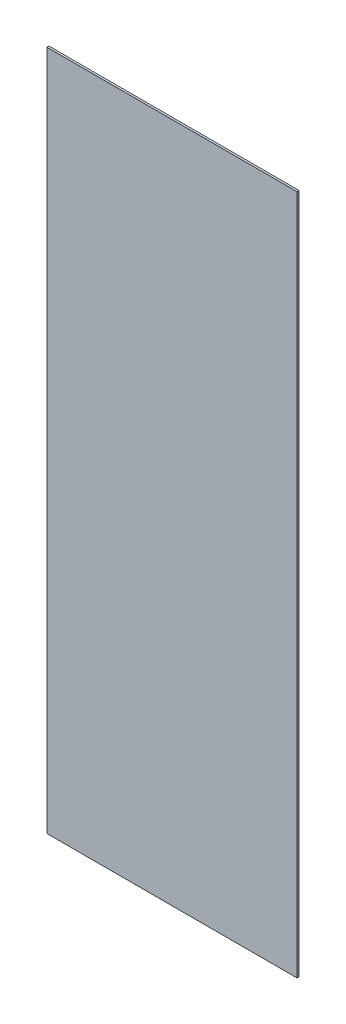
ISO-10303-21;
HEADER;
FILE_DESCRIPTION(('STEP AP214'),'2;1');
FILE_NAME('part.step','',(''),(''),'','','');
FILE_SCHEMA(('AUTOMOTIVE_DESIGN { 1 0 10303 214 1 1 1 1 }'));
ENDSEC;
DATA;
#1=APPLICATION_CONTEXT('core data for automotive mechanical design processes');
#2=APPLICATION_PROTOCOL_DEFINITION('international standard','automotive_design',2000,#1);
#3=PRODUCT_CONTEXT('',#1,'mechanical');
#4=PRODUCT('Part','Part','',(#3));
#5=PRODUCT_RELATED_PRODUCT_CATEGORY('part','',(#4));
#6=PRODUCT_DEFINITION_FORMATION('','',#4);
#7=PRODUCT_DEFINITION_CONTEXT('part definition',#1,'design');
#8=PRODUCT_DEFINITION('design','',#6,#7);
#9=PRODUCT_DEFINITION_SHAPE('','',#8);
#10=(LENGTH_UNIT() NAMED_UNIT(*) SI_UNIT(.MILLI.,.METRE.));
#11=(NAMED_UNIT(*) PLANE_ANGLE_UNIT() SI_UNIT($,.RADIAN.));
#12=(NAMED_UNIT(*) SI_UNIT($,.STERADIAN.) SOLID_ANGLE_UNIT());
#13=UNCERTAINTY_MEASURE_WITH_UNIT(LENGTH_MEASURE(1.E-05),#10,'distance_accuracy_value','');
#14=(GEOMETRIC_REPRESENTATION_CONTEXT(3) GLOBAL_UNCERTAINTY_ASSIGNED_CONTEXT((#13)) GLOBAL_UNIT_ASSIGNED_CONTEXT((#10,
#11,#12)) REPRESENTATION_CONTEXT('',''));
#15=CARTESIAN_POINT('',(0.,0.,0.));
#16=DIRECTION('',(0.,0.,1.));
#17=DIRECTION('',(1.,0.,0.));
#18=AXIS2_PLACEMENT_3D('',#15,#16,#17);
#19=CARTESIAN_POINT('',(-73.7158800001751,-2.66372512248482,1.21412));
#20=DIRECTION('',(1.,0.,0.));
#21=DIRECTION('',(0.,0.,-1.));
#22=AXIS2_PLACEMENT_3D('',#19,#20,#21);
#23=PLANE('',#22);
#24=DIRECTION('',(0.,-1.,0.));
#25=VECTOR('',#24,1.);
#26=CARTESIAN_POINT('',(-73.7158800001751,-2.66372512248482,0.));
#27=LINE('',#26,#25);
#28=CARTESIAN_POINT('',(-73.7158800001751,-2.66372512248482,0.));
#29=VERTEX_POINT('',#28);
#30=CARTESIAN_POINT('',(-73.7158800001751,-403.73627487754,0.));
#31=VERTEX_POINT('',#30);
#32=EDGE_CURVE('E100',#29,#31,#27,.T.);
#33=ORIENTED_EDGE('',*,*,#32,.T.);
#34=DIRECTION('',(0.,0.,-1.));
#35=VECTOR('',#34,1.);
#36=CARTESIAN_POINT('',(-73.7158800001751,-403.73627487754,1.21412));
#37=LINE('',#36,#35);
#38=CARTESIAN_POINT('',(-73.7158800001751,-403.73627487754,1.21412));
#39=VERTEX_POINT('',#38);
#40=EDGE_CURVE('E11',#39,#31,#37,.T.);
#41=ORIENTED_EDGE('',*,*,#40,.F.);
#42=DIRECTION('',(0.,-1.,0.));
#43=VECTOR('',#42,1.);
#44=CARTESIAN_POINT('',(-73.7158800001751,-2.66372512248482,1.21412));
#45=LINE('',#44,#43);
#46=CARTESIAN_POINT('',(-73.7158800001751,-2.66372512248482,1.21412));
#47=VERTEX_POINT('',#46);
#48=EDGE_CURVE('E88',#47,#39,#45,.T.);
#49=ORIENTED_EDGE('',*,*,#48,.F.);
#50=DIRECTION('',(0.,0.,-1.));
#51=VECTOR('',#50,1.);
#52=CARTESIAN_POINT('',(-73.7158800001751,-2.66372512248482,1.21412));
#53=LINE('',#52,#51);
#54=EDGE_CURVE('E96',#47,#29,#53,.T.);
#55=ORIENTED_EDGE('',*,*,#54,.T.);
#56=EDGE_LOOP('',(#33,#41,#49,#55));
#57=FACE_BOUND('',#56,.T.);
#58=ADVANCED_FACE('F37',(#57),#23,.F.);
#59=CARTESIAN_POINT('',(-73.7158800001751,-403.73627487754,1.21412));
#60=DIRECTION('',(0.,1.,0.));
#61=DIRECTION('',(0.,0.,1.));
#62=AXIS2_PLACEMENT_3D('',#59,#60,#61);
#63=PLANE('',#62);
#64=DIRECTION('',(1.,0.,0.));
#65=VECTOR('',#64,1.);
#66=CARTESIAN_POINT('',(-73.7158800001751,-403.73627487754,0.));
#67=LINE('',#66,#65);
#68=CARTESIAN_POINT('',(73.7158799998204,-403.73627487754,0.));
#69=VERTEX_POINT('',#68);
#70=EDGE_CURVE('E92',#31,#69,#67,.T.);
#71=ORIENTED_EDGE('',*,*,#70,.T.);
#72=DIRECTION('',(0.,0.,-1.));
#73=VECTOR('',#72,1.);
#74=CARTESIAN_POINT('',(73.7158799998204,-403.73627487754,1.21412));
#75=LINE('',#74,#73);
#76=CARTESIAN_POINT('',(73.7158799998204,-403.73627487754,1.21412));
#77=VERTEX_POINT('',#76);
#78=EDGE_CURVE('E45',#77,#69,#75,.T.);
#79=ORIENTED_EDGE('',*,*,#78,.F.);
#80=DIRECTION('',(1.,0.,0.));
#81=VECTOR('',#80,1.);
#82=CARTESIAN_POINT('',(-73.7158800001751,-403.73627487754,1.21412));
#83=LINE('',#82,#81);
#84=EDGE_CURVE('E83',#39,#77,#83,.T.);
#85=ORIENTED_EDGE('',*,*,#84,.F.);
#86=ORIENTED_EDGE('',*,*,#40,.T.);
#87=EDGE_LOOP('',(#71,#79,#85,#86));
#88=FACE_BOUND('',#87,.T.);
#89=ADVANCED_FACE('F91',(#88),#63,.F.);
#90=CARTESIAN_POINT('',(73.7158799998204,-2.66372512248482,1.21412));
#91=DIRECTION('',(-1.,0.,0.));
#92=DIRECTION('',(0.,0.,1.));
#93=AXIS2_PLACEMENT_3D('',#90,#91,#92);
#94=PLANE('',#93);
#95=DIRECTION('',(0.,1.,0.));
#96=VECTOR('',#95,1.);
#97=CARTESIAN_POINT('',(73.7158799998204,-2.66372512248482,0.));
#98=LINE('',#97,#96);
#99=CARTESIAN_POINT('',(73.7158799998204,-2.66372512248482,0.));
#100=VERTEX_POINT('',#99);
#101=EDGE_CURVE('E70',#69,#100,#98,.T.);
#102=ORIENTED_EDGE('',*,*,#101,.T.);
#103=DIRECTION('',(0.,0.,-1.));
#104=VECTOR('',#103,1.);
#105=CARTESIAN_POINT('',(73.7158799998204,-2.66372512248482,1.21412));
#106=LINE('',#105,#104);
#107=CARTESIAN_POINT('',(73.7158799998204,-2.66372512248482,1.21412));
#108=VERTEX_POINT('',#107);
#109=EDGE_CURVE('E93',#108,#100,#106,.T.);
#110=ORIENTED_EDGE('',*,*,#109,.F.);
#111=DIRECTION('',(0.,1.,0.));
#112=VECTOR('',#111,1.);
#113=CARTESIAN_POINT('',(73.7158799998204,-2.66372512248482,1.21412));
#114=LINE('',#113,#112);
#115=EDGE_CURVE('E86',#77,#108,#114,.T.);
#116=ORIENTED_EDGE('',*,*,#115,.F.);
#117=ORIENTED_EDGE('',*,*,#78,.T.);
#118=EDGE_LOOP('',(#102,#110,#116,#117));
#119=FACE_BOUND('',#118,.T.);
#120=ADVANCED_FACE('F94',(#119),#94,.F.);
#121=CARTESIAN_POINT('',(-73.7158800001751,-2.66372512248482,1.21412));
#122=DIRECTION('',(0.,-1.,0.));
#123=DIRECTION('',(0.,0.,-1.));
#124=AXIS2_PLACEMENT_3D('',#121,#122,#123);
#125=PLANE('',#124);
#126=DIRECTION('',(-1.,0.,0.));
#127=VECTOR('',#126,1.);
#128=CARTESIAN_POINT('',(-73.7158800001751,-2.66372512248482,0.));
#129=LINE('',#128,#127);
#130=EDGE_CURVE('E76',#100,#29,#129,.T.);
#131=ORIENTED_EDGE('',*,*,#130,.T.);
#132=ORIENTED_EDGE('',*,*,#54,.F.);
#133=DIRECTION('',(-1.,0.,0.));
#134=VECTOR('',#133,1.);
#135=CARTESIAN_POINT('',(-73.7158800001751,-2.66372512248482,1.21412));
#136=LINE('',#135,#134);
#137=EDGE_CURVE('E53',#108,#47,#136,.T.);
#138=ORIENTED_EDGE('',*,*,#137,.F.);
#139=ORIENTED_EDGE('',*,*,#109,.T.);
#140=EDGE_LOOP('',(#131,#132,#138,#139));
#141=FACE_BOUND('',#140,.T.);
#142=ADVANCED_FACE('F107',(#141),#125,.F.);
#143=CARTESIAN_POINT('',(0.,0.,1.21412));
#144=DIRECTION('',(0.,0.,1.));
#145=DIRECTION('',(1.,0.,0.));
#146=AXIS2_PLACEMENT_3D('',#143,#144,#145);
#147=PLANE('',#146);
#148=ORIENTED_EDGE('',*,*,#48,.T.);
#149=ORIENTED_EDGE('',*,*,#84,.T.);
#150=ORIENTED_EDGE('',*,*,#115,.T.);
#151=ORIENTED_EDGE('',*,*,#137,.T.);
#152=EDGE_LOOP('',(#148,#149,#150,#151));
#153=FACE_BOUND('',#152,.T.);
#154=ADVANCED_FACE('F84',(#153),#147,.T.);
#155=CARTESIAN_POINT('',(0.,0.,0.));
#156=DIRECTION('',(0.,0.,1.));
#157=DIRECTION('',(1.,0.,0.));
#158=AXIS2_PLACEMENT_3D('',#155,#156,#157);
#159=PLANE('',#158);
#160=ORIENTED_EDGE('',*,*,#32,.F.);
#161=ORIENTED_EDGE('',*,*,#130,.F.);
#162=ORIENTED_EDGE('',*,*,#101,.F.);
#163=ORIENTED_EDGE('',*,*,#70,.F.);
#164=EDGE_LOOP('',(#160,#161,#162,#163));
#165=FACE_BOUND('',#164,.T.);
#166=ADVANCED_FACE('F110',(#165),#159,.F.);
#167=CLOSED_SHELL('',(#58,#89,#120,#142,#154,#166));
#168=MANIFOLD_SOLID_BREP('B2',#167);
#169=ADVANCED_BREP_SHAPE_REPRESENTATION('',(#18,#168),#14);
#170=SHAPE_DEFINITION_REPRESENTATION(#9,#169);
ENDSEC;
END-ISO-10303-21;
